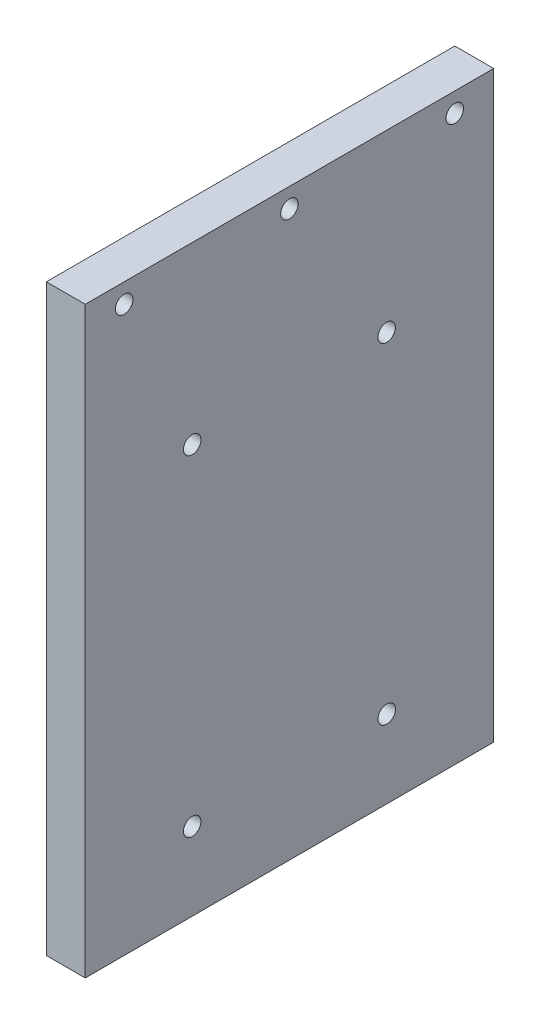
ISO-10303-21;
HEADER;
FILE_DESCRIPTION(('STEP AP214'),'2;1');
FILE_NAME('part.step','',(''),(''),'','','');
FILE_SCHEMA(('AUTOMOTIVE_DESIGN { 1 0 10303 214 1 1 1 1 }'));
ENDSEC;
DATA;
#1=APPLICATION_CONTEXT('core data for automotive mechanical design processes');
#2=APPLICATION_PROTOCOL_DEFINITION('international standard','automotive_design',2000,#1);
#3=PRODUCT_CONTEXT('',#1,'mechanical');
#4=PRODUCT('Part','Part','',(#3));
#5=PRODUCT_RELATED_PRODUCT_CATEGORY('part','',(#4));
#6=PRODUCT_DEFINITION_FORMATION('','',#4);
#7=PRODUCT_DEFINITION_CONTEXT('part definition',#1,'design');
#8=PRODUCT_DEFINITION('design','',#6,#7);
#9=PRODUCT_DEFINITION_SHAPE('','',#8);
#10=(LENGTH_UNIT() NAMED_UNIT(*) SI_UNIT(.MILLI.,.METRE.));
#11=(NAMED_UNIT(*) PLANE_ANGLE_UNIT() SI_UNIT($,.RADIAN.));
#12=(NAMED_UNIT(*) SI_UNIT($,.STERADIAN.) SOLID_ANGLE_UNIT());
#13=UNCERTAINTY_MEASURE_WITH_UNIT(LENGTH_MEASURE(1.E-05),#10,'distance_accuracy_value','');
#14=(GEOMETRIC_REPRESENTATION_CONTEXT(3) GLOBAL_UNCERTAINTY_ASSIGNED_CONTEXT((#13)) GLOBAL_UNIT_ASSIGNED_CONTEXT((#10,
#11,#12)) REPRESENTATION_CONTEXT('',''));
#15=CARTESIAN_POINT('',(0.,0.,0.));
#16=DIRECTION('',(0.,0.,1.));
#17=DIRECTION('',(1.,0.,0.));
#18=AXIS2_PLACEMENT_3D('',#15,#16,#17);
#19=CARTESIAN_POINT('',(10.,-75.,-52.5));
#20=DIRECTION('',(0.,0.,1.));
#21=DIRECTION('',(1.,0.,0.));
#22=AXIS2_PLACEMENT_3D('',#19,#20,#21);
#23=PLANE('',#22);
#24=DIRECTION('',(0.,1.,0.));
#25=VECTOR('',#24,1.);
#26=CARTESIAN_POINT('',(0.,-75.,-52.5));
#27=LINE('',#26,#25);
#28=CARTESIAN_POINT('',(0.,-75.,-52.5));
#29=VERTEX_POINT('',#28);
#30=CARTESIAN_POINT('',(0.,75.,-52.5));
#31=VERTEX_POINT('',#30);
#32=EDGE_CURVE('E102',#29,#31,#27,.T.);
#33=ORIENTED_EDGE('',*,*,#32,.T.);
#34=DIRECTION('',(-1.,0.,0.));
#35=VECTOR('',#34,1.);
#36=CARTESIAN_POINT('',(10.,75.,-52.5));
#37=LINE('',#36,#35);
#38=CARTESIAN_POINT('',(10.,75.,-52.5));
#39=VERTEX_POINT('',#38);
#40=EDGE_CURVE('E11',#39,#31,#37,.T.);
#41=ORIENTED_EDGE('',*,*,#40,.F.);
#42=DIRECTION('',(0.,1.,0.));
#43=VECTOR('',#42,1.);
#44=CARTESIAN_POINT('',(10.,-75.,-52.5));
#45=LINE('',#44,#43);
#46=CARTESIAN_POINT('',(10.,-75.,-52.5));
#47=VERTEX_POINT('',#46);
#48=EDGE_CURVE('E90',#47,#39,#45,.T.);
#49=ORIENTED_EDGE('',*,*,#48,.F.);
#50=DIRECTION('',(-1.,0.,0.));
#51=VECTOR('',#50,1.);
#52=CARTESIAN_POINT('',(10.,-75.,-52.5));
#53=LINE('',#52,#51);
#54=EDGE_CURVE('E98',#47,#29,#53,.T.);
#55=ORIENTED_EDGE('',*,*,#54,.T.);
#56=EDGE_LOOP('',(#33,#41,#49,#55));
#57=FACE_BOUND('',#56,.T.);
#58=ADVANCED_FACE('F39',(#57),#23,.F.);
#59=CARTESIAN_POINT('',(10.,75.,52.5));
#60=DIRECTION('',(0.,-1.,0.));
#61=DIRECTION('',(0.,0.,-1.));
#62=AXIS2_PLACEMENT_3D('',#59,#60,#61);
#63=PLANE('',#62);
#64=DIRECTION('',(0.,0.,1.));
#65=VECTOR('',#64,1.);
#66=CARTESIAN_POINT('',(0.,75.,52.5));
#67=LINE('',#66,#65);
#68=CARTESIAN_POINT('',(0.,75.,52.5));
#69=VERTEX_POINT('',#68);
#70=EDGE_CURVE('E94',#31,#69,#67,.T.);
#71=ORIENTED_EDGE('',*,*,#70,.T.);
#72=DIRECTION('',(-1.,0.,0.));
#73=VECTOR('',#72,1.);
#74=CARTESIAN_POINT('',(10.,75.,52.5));
#75=LINE('',#74,#73);
#76=CARTESIAN_POINT('',(10.,75.,52.5));
#77=VERTEX_POINT('',#76);
#78=EDGE_CURVE('E47',#77,#69,#75,.T.);
#79=ORIENTED_EDGE('',*,*,#78,.F.);
#80=DIRECTION('',(0.,0.,1.));
#81=VECTOR('',#80,1.);
#82=CARTESIAN_POINT('',(10.,75.,52.5));
#83=LINE('',#82,#81);
#84=EDGE_CURVE('E85',#39,#77,#83,.T.);
#85=ORIENTED_EDGE('',*,*,#84,.F.);
#86=ORIENTED_EDGE('',*,*,#40,.T.);
#87=EDGE_LOOP('',(#71,#79,#85,#86));
#88=FACE_BOUND('',#87,.T.);
#89=ADVANCED_FACE('F93',(#88),#63,.F.);
#90=CARTESIAN_POINT('',(10.,-75.,52.5));
#91=DIRECTION('',(0.,0.,-1.));
#92=DIRECTION('',(-1.,0.,0.));
#93=AXIS2_PLACEMENT_3D('',#90,#91,#92);
#94=PLANE('',#93);
#95=DIRECTION('',(0.,-1.,0.));
#96=VECTOR('',#95,1.);
#97=CARTESIAN_POINT('',(0.,-75.,52.5));
#98=LINE('',#97,#96);
#99=CARTESIAN_POINT('',(0.,-75.,52.5));
#100=VERTEX_POINT('',#99);
#101=EDGE_CURVE('E72',#69,#100,#98,.T.);
#102=ORIENTED_EDGE('',*,*,#101,.T.);
#103=DIRECTION('',(-1.,0.,0.));
#104=VECTOR('',#103,1.);
#105=CARTESIAN_POINT('',(10.,-75.,52.5));
#106=LINE('',#105,#104);
#107=CARTESIAN_POINT('',(10.,-75.,52.5));
#108=VERTEX_POINT('',#107);
#109=EDGE_CURVE('E95',#108,#100,#106,.T.);
#110=ORIENTED_EDGE('',*,*,#109,.F.);
#111=DIRECTION('',(0.,-1.,0.));
#112=VECTOR('',#111,1.);
#113=CARTESIAN_POINT('',(10.,-75.,52.5));
#114=LINE('',#113,#112);
#115=EDGE_CURVE('E88',#77,#108,#114,.T.);
#116=ORIENTED_EDGE('',*,*,#115,.F.);
#117=ORIENTED_EDGE('',*,*,#78,.T.);
#118=EDGE_LOOP('',(#102,#110,#116,#117));
#119=FACE_BOUND('',#118,.T.);
#120=ADVANCED_FACE('F96',(#119),#94,.F.);
#121=CARTESIAN_POINT('',(10.,-75.,52.5));
#122=DIRECTION('',(0.,1.,0.));
#123=DIRECTION('',(0.,0.,1.));
#124=AXIS2_PLACEMENT_3D('',#121,#122,#123);
#125=PLANE('',#124);
#126=DIRECTION('',(0.,0.,-1.));
#127=VECTOR('',#126,1.);
#128=CARTESIAN_POINT('',(0.,-75.,52.5));
#129=LINE('',#128,#127);
#130=EDGE_CURVE('E78',#100,#29,#129,.T.);
#131=ORIENTED_EDGE('',*,*,#130,.T.);
#132=ORIENTED_EDGE('',*,*,#54,.F.);
#133=DIRECTION('',(0.,0.,-1.));
#134=VECTOR('',#133,1.);
#135=CARTESIAN_POINT('',(10.,-75.,52.5));
#136=LINE('',#135,#134);
#137=EDGE_CURVE('E55',#108,#47,#136,.T.);
#138=ORIENTED_EDGE('',*,*,#137,.F.);
#139=ORIENTED_EDGE('',*,*,#109,.T.);
#140=EDGE_LOOP('',(#131,#132,#138,#139));
#141=FACE_BOUND('',#140,.T.);
#142=ADVANCED_FACE('F110',(#141),#125,.F.);
#143=CARTESIAN_POINT('',(10.,0.,0.));
#144=DIRECTION('',(-1.,0.,0.));
#145=DIRECTION('',(0.,0.,1.));
#146=AXIS2_PLACEMENT_3D('',#143,#144,#145);
#147=PLANE('',#146);
#148=CARTESIAN_POINT('',(10.,30.,25.));
#149=DIRECTION('',(1.,0.,0.));
#150=DIRECTION('',(0.,0.,-1.));
#151=AXIS2_PLACEMENT_3D('',#148,#149,#150);
#152=CIRCLE('',#151,2.25);
#153=CARTESIAN_POINT('',(10.,30.,22.75));
#154=VERTEX_POINT('',#153);
#155=EDGE_CURVE('E137',#154,#154,#152,.T.);
#156=ORIENTED_EDGE('',*,*,#155,.F.);
#157=EDGE_LOOP('',(#156));
#158=FACE_BOUND('',#157,.T.);
#159=CARTESIAN_POINT('',(10.,-55.,-25.));
#160=DIRECTION('',(1.,0.,0.));
#161=DIRECTION('',(0.,0.,-1.));
#162=AXIS2_PLACEMENT_3D('',#159,#160,#161);
#163=CIRCLE('',#162,2.25);
#164=CARTESIAN_POINT('',(10.,-55.,-27.25));
#165=VERTEX_POINT('',#164);
#166=EDGE_CURVE('E143',#165,#165,#163,.T.);
#167=ORIENTED_EDGE('',*,*,#166,.F.);
#168=EDGE_LOOP('',(#167));
#169=FACE_BOUND('',#168,.T.);
#170=CARTESIAN_POINT('',(10.,-55.,25.));
#171=DIRECTION('',(1.,0.,0.));
#172=DIRECTION('',(0.,0.,-1.));
#173=AXIS2_PLACEMENT_3D('',#170,#171,#172);
#174=CIRCLE('',#173,2.25);
#175=CARTESIAN_POINT('',(10.,-55.,22.75));
#176=VERTEX_POINT('',#175);
#177=EDGE_CURVE('E144',#176,#176,#174,.T.);
#178=ORIENTED_EDGE('',*,*,#177,.F.);
#179=EDGE_LOOP('',(#178));
#180=FACE_BOUND('',#179,.T.);
#181=CARTESIAN_POINT('',(10.,30.,-25.));
#182=DIRECTION('',(1.,0.,0.));
#183=DIRECTION('',(0.,0.,-1.));
#184=AXIS2_PLACEMENT_3D('',#181,#182,#183);
#185=CIRCLE('',#184,2.25);
#186=CARTESIAN_POINT('',(10.,30.,-27.25));
#187=VERTEX_POINT('',#186);
#188=EDGE_CURVE('E134',#187,#187,#185,.T.);
#189=ORIENTED_EDGE('',*,*,#188,.F.);
#190=EDGE_LOOP('',(#189));
#191=FACE_BOUND('',#190,.T.);
#192=CARTESIAN_POINT('',(10.,70.,42.5));
#193=DIRECTION('',(1.,0.,0.));
#194=DIRECTION('',(0.,0.,-1.));
#195=AXIS2_PLACEMENT_3D('',#192,#193,#194);
#196=CIRCLE('',#195,2.25);
#197=CARTESIAN_POINT('',(10.,70.,40.25));
#198=VERTEX_POINT('',#197);
#199=EDGE_CURVE('E129',#198,#198,#196,.T.);
#200=ORIENTED_EDGE('',*,*,#199,.F.);
#201=EDGE_LOOP('',(#200));
#202=FACE_BOUND('',#201,.T.);
#203=CARTESIAN_POINT('',(10.,70.,0.));
#204=DIRECTION('',(1.,0.,0.));
#205=DIRECTION('',(0.,0.,-1.));
#206=AXIS2_PLACEMENT_3D('',#203,#204,#205);
#207=CIRCLE('',#206,2.25);
#208=CARTESIAN_POINT('',(10.,70.,-2.25));
#209=VERTEX_POINT('',#208);
#210=EDGE_CURVE('E126',#209,#209,#207,.T.);
#211=ORIENTED_EDGE('',*,*,#210,.F.);
#212=EDGE_LOOP('',(#211));
#213=FACE_BOUND('',#212,.T.);
#214=CARTESIAN_POINT('',(10.,70.,-42.5));
#215=DIRECTION('',(1.,0.,0.));
#216=DIRECTION('',(0.,0.,-1.));
#217=AXIS2_PLACEMENT_3D('',#214,#215,#216);
#218=CIRCLE('',#217,2.25);
#219=CARTESIAN_POINT('',(10.,70.,-44.75));
#220=VERTEX_POINT('',#219);
#221=EDGE_CURVE('E119',#220,#220,#218,.T.);
#222=ORIENTED_EDGE('',*,*,#221,.F.);
#223=EDGE_LOOP('',(#222));
#224=FACE_BOUND('',#223,.T.);
#225=ORIENTED_EDGE('',*,*,#48,.T.);
#226=ORIENTED_EDGE('',*,*,#84,.T.);
#227=ORIENTED_EDGE('',*,*,#115,.T.);
#228=ORIENTED_EDGE('',*,*,#137,.T.);
#229=EDGE_LOOP('',(#225,#226,#227,#228));
#230=FACE_BOUND('',#229,.T.);
#231=ADVANCED_FACE('F86',(#158,#169,#180,#191,#202,#213,#224,#230),#147,.F.);
#232=CARTESIAN_POINT('',(0.,0.,0.));
#233=DIRECTION('',(-1.,0.,0.));
#234=DIRECTION('',(0.,0.,1.));
#235=AXIS2_PLACEMENT_3D('',#232,#233,#234);
#236=PLANE('',#235);
#237=CARTESIAN_POINT('',(0.,30.,25.));
#238=DIRECTION('',(1.,0.,0.));
#239=DIRECTION('',(0.,0.,-1.));
#240=AXIS2_PLACEMENT_3D('',#237,#238,#239);
#241=CIRCLE('',#240,2.25);
#242=CARTESIAN_POINT('',(0.,30.,22.75));
#243=VERTEX_POINT('',#242);
#244=EDGE_CURVE('E147',#243,#243,#241,.T.);
#245=ORIENTED_EDGE('',*,*,#244,.T.);
#246=EDGE_LOOP('',(#245));
#247=FACE_BOUND('',#246,.T.);
#248=CARTESIAN_POINT('',(0.,-55.,-25.));
#249=DIRECTION('',(1.,0.,0.));
#250=DIRECTION('',(0.,0.,-1.));
#251=AXIS2_PLACEMENT_3D('',#248,#249,#250);
#252=CIRCLE('',#251,2.25);
#253=CARTESIAN_POINT('',(0.,-55.,-27.25));
#254=VERTEX_POINT('',#253);
#255=EDGE_CURVE('E140',#254,#254,#252,.T.);
#256=ORIENTED_EDGE('',*,*,#255,.T.);
#257=EDGE_LOOP('',(#256));
#258=FACE_BOUND('',#257,.T.);
#259=CARTESIAN_POINT('',(0.,-55.,25.));
#260=DIRECTION('',(1.,0.,0.));
#261=DIRECTION('',(0.,0.,-1.));
#262=AXIS2_PLACEMENT_3D('',#259,#260,#261);
#263=CIRCLE('',#262,2.25);
#264=CARTESIAN_POINT('',(0.,-55.,22.75));
#265=VERTEX_POINT('',#264);
#266=EDGE_CURVE('E152',#265,#265,#263,.T.);
#267=ORIENTED_EDGE('',*,*,#266,.T.);
#268=EDGE_LOOP('',(#267));
#269=FACE_BOUND('',#268,.T.);
#270=CARTESIAN_POINT('',(0.,30.,-25.));
#271=DIRECTION('',(1.,0.,0.));
#272=DIRECTION('',(0.,0.,-1.));
#273=AXIS2_PLACEMENT_3D('',#270,#271,#272);
#274=CIRCLE('',#273,2.25);
#275=CARTESIAN_POINT('',(0.,30.,-27.25));
#276=VERTEX_POINT('',#275);
#277=EDGE_CURVE('E120',#276,#276,#274,.T.);
#278=ORIENTED_EDGE('',*,*,#277,.T.);
#279=EDGE_LOOP('',(#278));
#280=FACE_BOUND('',#279,.T.);
#281=CARTESIAN_POINT('',(0.,70.,42.5));
#282=DIRECTION('',(1.,0.,0.));
#283=DIRECTION('',(0.,0.,-1.));
#284=AXIS2_PLACEMENT_3D('',#281,#282,#283);
#285=CIRCLE('',#284,2.25);
#286=CARTESIAN_POINT('',(0.,70.,40.25));
#287=VERTEX_POINT('',#286);
#288=EDGE_CURVE('E105',#287,#287,#285,.T.);
#289=ORIENTED_EDGE('',*,*,#288,.T.);
#290=EDGE_LOOP('',(#289));
#291=FACE_BOUND('',#290,.T.);
#292=CARTESIAN_POINT('',(0.,70.,0.));
#293=DIRECTION('',(1.,0.,0.));
#294=DIRECTION('',(0.,0.,-1.));
#295=AXIS2_PLACEMENT_3D('',#292,#293,#294);
#296=CIRCLE('',#295,2.25);
#297=CARTESIAN_POINT('',(0.,70.,-2.25));
#298=VERTEX_POINT('',#297);
#299=EDGE_CURVE('E123',#298,#298,#296,.T.);
#300=ORIENTED_EDGE('',*,*,#299,.T.);
#301=EDGE_LOOP('',(#300));
#302=FACE_BOUND('',#301,.T.);
#303=CARTESIAN_POINT('',(0.,70.,-42.5));
#304=DIRECTION('',(1.,0.,0.));
#305=DIRECTION('',(0.,0.,-1.));
#306=AXIS2_PLACEMENT_3D('',#303,#304,#305);
#307=CIRCLE('',#306,2.25);
#308=CARTESIAN_POINT('',(0.,70.,-44.75));
#309=VERTEX_POINT('',#308);
#310=EDGE_CURVE('E116',#309,#309,#307,.T.);
#311=ORIENTED_EDGE('',*,*,#310,.T.);
#312=EDGE_LOOP('',(#311));
#313=FACE_BOUND('',#312,.T.);
#314=ORIENTED_EDGE('',*,*,#32,.F.);
#315=ORIENTED_EDGE('',*,*,#130,.F.);
#316=ORIENTED_EDGE('',*,*,#101,.F.);
#317=ORIENTED_EDGE('',*,*,#70,.F.);
#318=EDGE_LOOP('',(#314,#315,#316,#317));
#319=FACE_BOUND('',#318,.T.);
#320=ADVANCED_FACE('F113',(#247,#258,#269,#280,#291,#302,#313,#319),#236,.T.);
#321=CARTESIAN_POINT('',(0.,70.,-42.5));
#322=DIRECTION('',(1.,0.,0.));
#323=DIRECTION('',(0.,0.,-1.));
#324=AXIS2_PLACEMENT_3D('',#321,#322,#323);
#325=CYLINDRICAL_SURFACE('',#324,2.25);
#326=ORIENTED_EDGE('',*,*,#310,.F.);
#327=EDGE_LOOP('',(#326));
#328=FACE_BOUND('',#327,.T.);
#329=ORIENTED_EDGE('',*,*,#221,.T.);
#330=EDGE_LOOP('',(#329));
#331=FACE_BOUND('',#330,.T.);
#332=ADVANCED_FACE('F172',(#328,#331),#325,.F.);
#333=CARTESIAN_POINT('',(0.,70.,0.));
#334=DIRECTION('',(1.,0.,0.));
#335=DIRECTION('',(0.,0.,-1.));
#336=AXIS2_PLACEMENT_3D('',#333,#334,#335);
#337=CYLINDRICAL_SURFACE('',#336,2.25);
#338=ORIENTED_EDGE('',*,*,#299,.F.);
#339=EDGE_LOOP('',(#338));
#340=FACE_BOUND('',#339,.T.);
#341=ORIENTED_EDGE('',*,*,#210,.T.);
#342=EDGE_LOOP('',(#341));
#343=FACE_BOUND('',#342,.T.);
#344=ADVANCED_FACE('F174',(#340,#343),#337,.F.);
#345=CARTESIAN_POINT('',(0.,70.,42.5));
#346=DIRECTION('',(1.,0.,0.));
#347=DIRECTION('',(0.,0.,-1.));
#348=AXIS2_PLACEMENT_3D('',#345,#346,#347);
#349=CYLINDRICAL_SURFACE('',#348,2.25);
#350=ORIENTED_EDGE('',*,*,#288,.F.);
#351=EDGE_LOOP('',(#350));
#352=FACE_BOUND('',#351,.T.);
#353=ORIENTED_EDGE('',*,*,#199,.T.);
#354=EDGE_LOOP('',(#353));
#355=FACE_BOUND('',#354,.T.);
#356=ADVANCED_FACE('F181',(#352,#355),#349,.F.);
#357=CARTESIAN_POINT('',(0.,30.,-25.));
#358=DIRECTION('',(1.,0.,0.));
#359=DIRECTION('',(0.,0.,-1.));
#360=AXIS2_PLACEMENT_3D('',#357,#358,#359);
#361=CYLINDRICAL_SURFACE('',#360,2.25);
#362=ORIENTED_EDGE('',*,*,#277,.F.);
#363=EDGE_LOOP('',(#362));
#364=FACE_BOUND('',#363,.T.);
#365=ORIENTED_EDGE('',*,*,#188,.T.);
#366=EDGE_LOOP('',(#365));
#367=FACE_BOUND('',#366,.T.);
#368=ADVANCED_FACE('F241',(#364,#367),#361,.F.);
#369=CARTESIAN_POINT('',(0.,-55.,25.));
#370=DIRECTION('',(1.,0.,0.));
#371=DIRECTION('',(0.,0.,-1.));
#372=AXIS2_PLACEMENT_3D('',#369,#370,#371);
#373=CYLINDRICAL_SURFACE('',#372,2.25);
#374=ORIENTED_EDGE('',*,*,#266,.F.);
#375=EDGE_LOOP('',(#374));
#376=FACE_BOUND('',#375,.T.);
#377=ORIENTED_EDGE('',*,*,#177,.T.);
#378=EDGE_LOOP('',(#377));
#379=FACE_BOUND('',#378,.T.);
#380=ADVANCED_FACE('F158',(#376,#379),#373,.F.);
#381=CARTESIAN_POINT('',(0.,-55.,-25.));
#382=DIRECTION('',(1.,0.,0.));
#383=DIRECTION('',(0.,0.,-1.));
#384=AXIS2_PLACEMENT_3D('',#381,#382,#383);
#385=CYLINDRICAL_SURFACE('',#384,2.25);
#386=ORIENTED_EDGE('',*,*,#255,.F.);
#387=EDGE_LOOP('',(#386));
#388=FACE_BOUND('',#387,.T.);
#389=ORIENTED_EDGE('',*,*,#166,.T.);
#390=EDGE_LOOP('',(#389));
#391=FACE_BOUND('',#390,.T.);
#392=ADVANCED_FACE('F258',(#388,#391),#385,.F.);
#393=CARTESIAN_POINT('',(0.,30.,25.));
#394=DIRECTION('',(1.,0.,0.));
#395=DIRECTION('',(0.,0.,-1.));
#396=AXIS2_PLACEMENT_3D('',#393,#394,#395);
#397=CYLINDRICAL_SURFACE('',#396,2.25);
#398=ORIENTED_EDGE('',*,*,#244,.F.);
#399=EDGE_LOOP('',(#398));
#400=FACE_BOUND('',#399,.T.);
#401=ORIENTED_EDGE('',*,*,#155,.T.);
#402=EDGE_LOOP('',(#401));
#403=FACE_BOUND('',#402,.T.);
#404=ADVANCED_FACE('F267',(#400,#403),#397,.F.);
#405=CLOSED_SHELL('',(#58,#89,#120,#142,#231,#320,#332,#344,#356,#368,#380,#392,#404));
#406=MANIFOLD_SOLID_BREP('B2',#405);
#407=ADVANCED_BREP_SHAPE_REPRESENTATION('',(#18,#406),#14);
#408=SHAPE_DEFINITION_REPRESENTATION(#9,#407);
ENDSEC;
END-ISO-10303-21;
